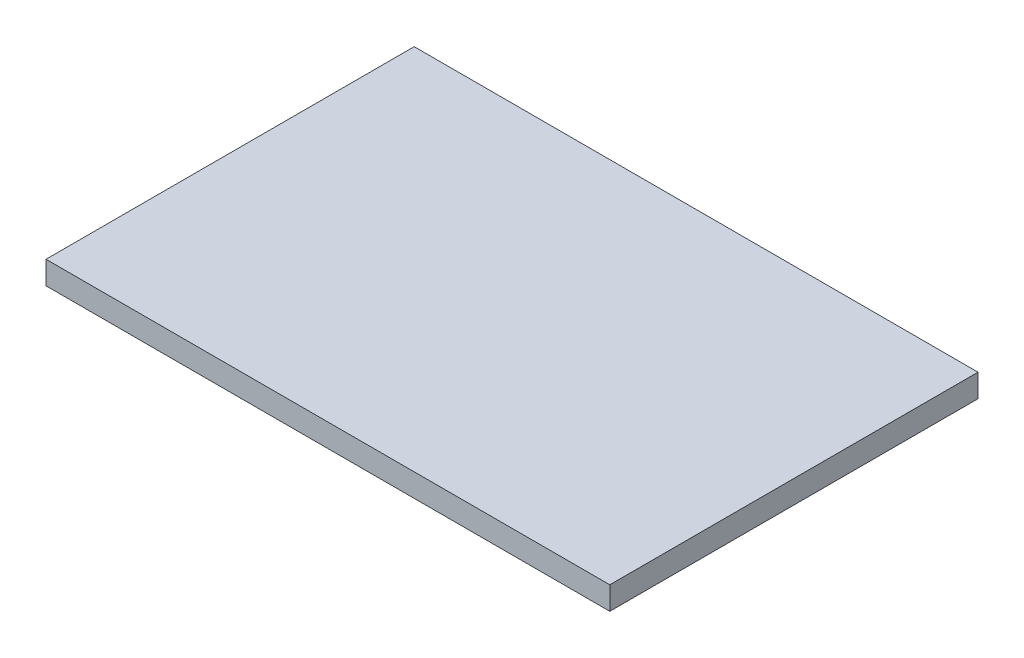
ISO-10303-21;
HEADER;
FILE_DESCRIPTION(('STEP AP214'),'2;1');
FILE_NAME('part.step','',(''),(''),'','','');
FILE_SCHEMA(('AUTOMOTIVE_DESIGN { 1 0 10303 214 1 1 1 1 }'));
ENDSEC;
DATA;
#1=APPLICATION_CONTEXT('core data for automotive mechanical design processes');
#2=APPLICATION_PROTOCOL_DEFINITION('international standard','automotive_design',2000,#1);
#3=PRODUCT_CONTEXT('',#1,'mechanical');
#4=PRODUCT('Part','Part','',(#3));
#5=PRODUCT_RELATED_PRODUCT_CATEGORY('part','',(#4));
#6=PRODUCT_DEFINITION_FORMATION('','',#4);
#7=PRODUCT_DEFINITION_CONTEXT('part definition',#1,'design');
#8=PRODUCT_DEFINITION('design','',#6,#7);
#9=PRODUCT_DEFINITION_SHAPE('','',#8);
#10=(LENGTH_UNIT() NAMED_UNIT(*) SI_UNIT(.MILLI.,.METRE.));
#11=(NAMED_UNIT(*) PLANE_ANGLE_UNIT() SI_UNIT($,.RADIAN.));
#12=(NAMED_UNIT(*) SI_UNIT($,.STERADIAN.) SOLID_ANGLE_UNIT());
#13=UNCERTAINTY_MEASURE_WITH_UNIT(LENGTH_MEASURE(1.E-05),#10,'distance_accuracy_value','');
#14=(GEOMETRIC_REPRESENTATION_CONTEXT(3) GLOBAL_UNCERTAINTY_ASSIGNED_CONTEXT((#13)) GLOBAL_UNIT_ASSIGNED_CONTEXT((#10,
#11,#12)) REPRESENTATION_CONTEXT('',''));
#15=CARTESIAN_POINT('',(0.,0.,0.));
#16=DIRECTION('',(0.,0.,1.));
#17=DIRECTION('',(1.,0.,0.));
#18=AXIS2_PLACEMENT_3D('',#15,#16,#17);
#19=CARTESIAN_POINT('',(43.1888888888889,7.35555555555552,8.25));
#20=DIRECTION('',(1.,0.,0.));
#21=DIRECTION('',(0.,1.,0.));
#22=AXIS2_PLACEMENT_3D('',#19,#20,#21);
#23=PLANE('',#22);
#24=DIRECTION('',(0.,0.,-1.));
#25=VECTOR('',#24,1.);
#26=CARTESIAN_POINT('',(43.1888888888889,8.35555555555552,8.25));
#27=LINE('',#26,#25);
#28=CARTESIAN_POINT('',(43.1888888888889,8.35555555555552,8.25));
#29=VERTEX_POINT('',#28);
#30=CARTESIAN_POINT('',(43.1888888888889,8.35555555555558,-7.75));
#31=VERTEX_POINT('',#30);
#32=EDGE_CURVE('E98',#29,#31,#27,.T.);
#33=ORIENTED_EDGE('',*,*,#32,.T.);
#34=DIRECTION('',(0.,1.,0.));
#35=VECTOR('',#34,1.);
#36=CARTESIAN_POINT('',(43.1888888888889,7.35555555555558,-7.75));
#37=LINE('',#36,#35);
#38=CARTESIAN_POINT('',(43.1888888888889,7.35555555555558,-7.75));
#39=VERTEX_POINT('',#38);
#40=EDGE_CURVE('E11',#39,#31,#37,.T.);
#41=ORIENTED_EDGE('',*,*,#40,.F.);
#42=DIRECTION('',(0.,0.,-1.));
#43=VECTOR('',#42,1.);
#44=CARTESIAN_POINT('',(43.1888888888889,7.35555555555552,8.25));
#45=LINE('',#44,#43);
#46=CARTESIAN_POINT('',(43.1888888888889,7.35555555555552,8.25));
#47=VERTEX_POINT('',#46);
#48=EDGE_CURVE('E86',#47,#39,#45,.T.);
#49=ORIENTED_EDGE('',*,*,#48,.F.);
#50=DIRECTION('',(0.,1.,0.));
#51=VECTOR('',#50,1.);
#52=CARTESIAN_POINT('',(43.1888888888889,7.35555555555552,8.25));
#53=LINE('',#52,#51);
#54=EDGE_CURVE('E94',#47,#29,#53,.T.);
#55=ORIENTED_EDGE('',*,*,#54,.T.);
#56=EDGE_LOOP('',(#33,#41,#49,#55));
#57=FACE_BOUND('',#56,.T.);
#58=ADVANCED_FACE('F35',(#57),#23,.F.);
#59=CARTESIAN_POINT('',(43.1888888888889,7.35555555555558,-7.75));
#60=DIRECTION('',(0.,0.,1.));
#61=DIRECTION('',(0.,-1.,0.));
#62=AXIS2_PLACEMENT_3D('',#59,#60,#61);
#63=PLANE('',#62);
#64=DIRECTION('',(1.,0.,0.));
#65=VECTOR('',#64,1.);
#66=CARTESIAN_POINT('',(43.1888888888889,8.35555555555558,-7.75));
#67=LINE('',#66,#65);
#68=CARTESIAN_POINT('',(67.6888888888889,8.35555555555558,-7.75));
#69=VERTEX_POINT('',#68);
#70=EDGE_CURVE('E90',#31,#69,#67,.T.);
#71=ORIENTED_EDGE('',*,*,#70,.T.);
#72=DIRECTION('',(0.,1.,0.));
#73=VECTOR('',#72,1.);
#74=CARTESIAN_POINT('',(67.6888888888889,7.35555555555558,-7.75));
#75=LINE('',#74,#73);
#76=CARTESIAN_POINT('',(67.6888888888889,7.35555555555558,-7.75));
#77=VERTEX_POINT('',#76);
#78=EDGE_CURVE('E43',#77,#69,#75,.T.);
#79=ORIENTED_EDGE('',*,*,#78,.F.);
#80=DIRECTION('',(1.,0.,0.));
#81=VECTOR('',#80,1.);
#82=CARTESIAN_POINT('',(43.1888888888889,7.35555555555558,-7.75));
#83=LINE('',#82,#81);
#84=EDGE_CURVE('E81',#39,#77,#83,.T.);
#85=ORIENTED_EDGE('',*,*,#84,.F.);
#86=ORIENTED_EDGE('',*,*,#40,.T.);
#87=EDGE_LOOP('',(#71,#79,#85,#86));
#88=FACE_BOUND('',#87,.T.);
#89=ADVANCED_FACE('F89',(#88),#63,.F.);
#90=CARTESIAN_POINT('',(67.6888888888889,7.35555555555552,8.25));
#91=DIRECTION('',(-1.,0.,0.));
#92=DIRECTION('',(0.,0.,-1.));
#93=AXIS2_PLACEMENT_3D('',#90,#91,#92);
#94=PLANE('',#93);
#95=DIRECTION('',(0.,0.,1.));
#96=VECTOR('',#95,1.);
#97=CARTESIAN_POINT('',(67.6888888888889,8.35555555555552,8.25));
#98=LINE('',#97,#96);
#99=CARTESIAN_POINT('',(67.6888888888889,8.35555555555552,8.25));
#100=VERTEX_POINT('',#99);
#101=EDGE_CURVE('E68',#69,#100,#98,.T.);
#102=ORIENTED_EDGE('',*,*,#101,.T.);
#103=DIRECTION('',(0.,1.,0.));
#104=VECTOR('',#103,1.);
#105=CARTESIAN_POINT('',(67.6888888888889,7.35555555555552,8.25));
#106=LINE('',#105,#104);
#107=CARTESIAN_POINT('',(67.6888888888889,7.35555555555552,8.25));
#108=VERTEX_POINT('',#107);
#109=EDGE_CURVE('E91',#108,#100,#106,.T.);
#110=ORIENTED_EDGE('',*,*,#109,.F.);
#111=DIRECTION('',(0.,0.,1.));
#112=VECTOR('',#111,1.);
#113=CARTESIAN_POINT('',(67.6888888888889,7.35555555555552,8.25));
#114=LINE('',#113,#112);
#115=EDGE_CURVE('E84',#77,#108,#114,.T.);
#116=ORIENTED_EDGE('',*,*,#115,.F.);
#117=ORIENTED_EDGE('',*,*,#78,.T.);
#118=EDGE_LOOP('',(#102,#110,#116,#117));
#119=FACE_BOUND('',#118,.T.);
#120=ADVANCED_FACE('F92',(#119),#94,.F.);
#121=CARTESIAN_POINT('',(43.1888888888889,7.35555555555552,8.25));
#122=DIRECTION('',(0.,0.,-1.));
#123=DIRECTION('',(0.,1.,0.));
#124=AXIS2_PLACEMENT_3D('',#121,#122,#123);
#125=PLANE('',#124);
#126=DIRECTION('',(-1.,0.,0.));
#127=VECTOR('',#126,1.);
#128=CARTESIAN_POINT('',(43.1888888888889,8.35555555555552,8.25));
#129=LINE('',#128,#127);
#130=EDGE_CURVE('E74',#100,#29,#129,.T.);
#131=ORIENTED_EDGE('',*,*,#130,.T.);
#132=ORIENTED_EDGE('',*,*,#54,.F.);
#133=DIRECTION('',(-1.,0.,0.));
#134=VECTOR('',#133,1.);
#135=CARTESIAN_POINT('',(43.1888888888889,7.35555555555552,8.25));
#136=LINE('',#135,#134);
#137=EDGE_CURVE('E51',#108,#47,#136,.T.);
#138=ORIENTED_EDGE('',*,*,#137,.F.);
#139=ORIENTED_EDGE('',*,*,#109,.T.);
#140=EDGE_LOOP('',(#131,#132,#138,#139));
#141=FACE_BOUND('',#140,.T.);
#142=ADVANCED_FACE('F105',(#141),#125,.F.);
#143=CARTESIAN_POINT('',(0.,7.35555555555558,-7.85555555555555));
#144=DIRECTION('',(0.,-1.,0.));
#145=DIRECTION('',(1.,0.,0.));
#146=AXIS2_PLACEMENT_3D('',#143,#144,#145);
#147=PLANE('',#146);
#148=ORIENTED_EDGE('',*,*,#48,.T.);
#149=ORIENTED_EDGE('',*,*,#84,.T.);
#150=ORIENTED_EDGE('',*,*,#115,.T.);
#151=ORIENTED_EDGE('',*,*,#137,.T.);
#152=EDGE_LOOP('',(#148,#149,#150,#151));
#153=FACE_BOUND('',#152,.T.);
#154=ADVANCED_FACE('F82',(#153),#147,.T.);
#155=CARTESIAN_POINT('',(0.,8.35555555555558,-7.85555555555555));
#156=DIRECTION('',(0.,-1.,0.));
#157=DIRECTION('',(1.,0.,0.));
#158=AXIS2_PLACEMENT_3D('',#155,#156,#157);
#159=PLANE('',#158);
#160=ORIENTED_EDGE('',*,*,#32,.F.);
#161=ORIENTED_EDGE('',*,*,#130,.F.);
#162=ORIENTED_EDGE('',*,*,#101,.F.);
#163=ORIENTED_EDGE('',*,*,#70,.F.);
#164=EDGE_LOOP('',(#160,#161,#162,#163));
#165=FACE_BOUND('',#164,.T.);
#166=ADVANCED_FACE('F108',(#165),#159,.F.);
#167=CLOSED_SHELL('',(#58,#89,#120,#142,#154,#166));
#168=MANIFOLD_SOLID_BREP('B2',#167);
#169=ADVANCED_BREP_SHAPE_REPRESENTATION('',(#18,#168),#14);
#170=SHAPE_DEFINITION_REPRESENTATION(#9,#169);
ENDSEC;
END-ISO-10303-21;
